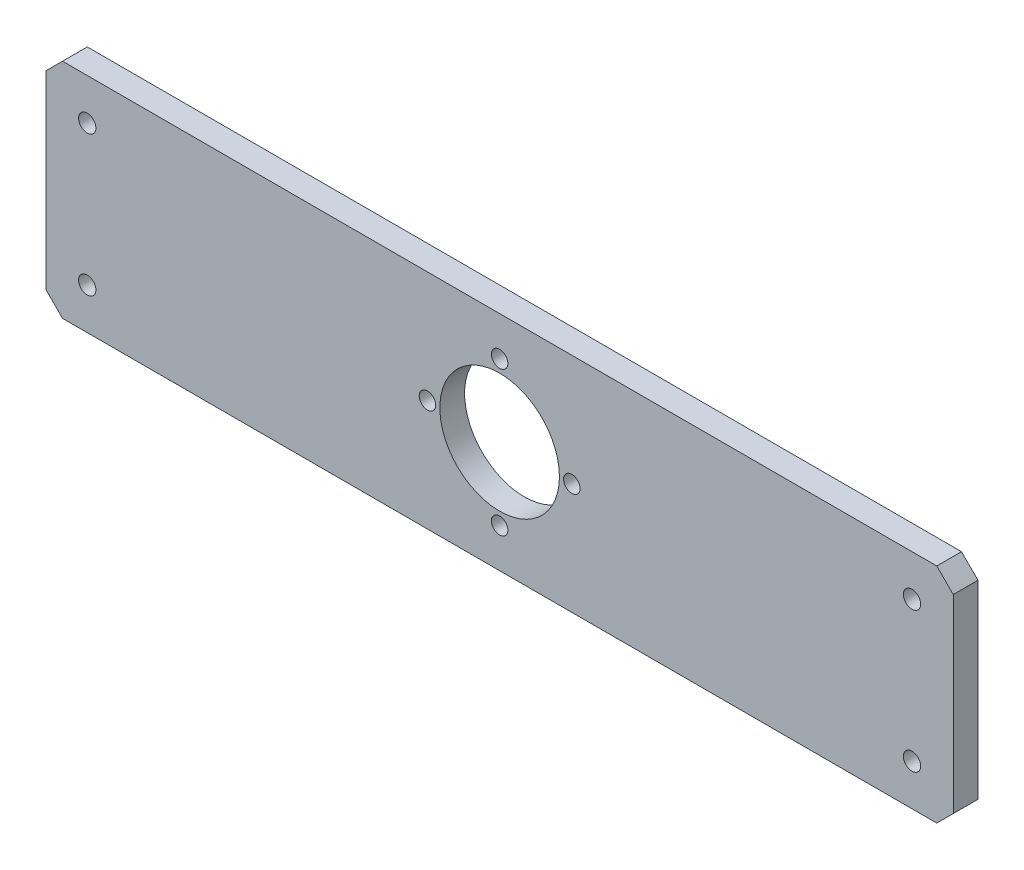
ISO-10303-21;
HEADER;
FILE_DESCRIPTION(('STEP AP214'),'2;1');
FILE_NAME('part.step','',(''),(''),'','','');
FILE_SCHEMA(('AUTOMOTIVE_DESIGN { 1 0 10303 214 1 1 1 1 }'));
ENDSEC;
DATA;
#1=APPLICATION_CONTEXT('core data for automotive mechanical design processes');
#2=APPLICATION_PROTOCOL_DEFINITION('international standard','automotive_design',2000,#1);
#3=PRODUCT_CONTEXT('',#1,'mechanical');
#4=PRODUCT('Part','Part','',(#3));
#5=PRODUCT_RELATED_PRODUCT_CATEGORY('part','',(#4));
#6=PRODUCT_DEFINITION_FORMATION('','',#4);
#7=PRODUCT_DEFINITION_CONTEXT('part definition',#1,'design');
#8=PRODUCT_DEFINITION('design','',#6,#7);
#9=PRODUCT_DEFINITION_SHAPE('','',#8);
#10=(LENGTH_UNIT() NAMED_UNIT(*) SI_UNIT(.MILLI.,.METRE.));
#11=(NAMED_UNIT(*) PLANE_ANGLE_UNIT() SI_UNIT($,.RADIAN.));
#12=(NAMED_UNIT(*) SI_UNIT($,.STERADIAN.) SOLID_ANGLE_UNIT());
#13=UNCERTAINTY_MEASURE_WITH_UNIT(LENGTH_MEASURE(1.E-05),#10,'distance_accuracy_value','');
#14=(GEOMETRIC_REPRESENTATION_CONTEXT(3) GLOBAL_UNCERTAINTY_ASSIGNED_CONTEXT((#13)) GLOBAL_UNIT_ASSIGNED_CONTEXT((#10,
#11,#12)) REPRESENTATION_CONTEXT('',''));
#15=CARTESIAN_POINT('',(0.,0.,0.));
#16=DIRECTION('',(0.,0.,1.));
#17=DIRECTION('',(1.,0.,0.));
#18=AXIS2_PLACEMENT_3D('',#15,#16,#17);
#19=CARTESIAN_POINT('',(0.,0.,3.));
#20=DIRECTION('',(0.,0.,1.));
#21=DIRECTION('',(1.,0.,0.));
#22=AXIS2_PLACEMENT_3D('',#19,#20,#21);
#23=PLANE('',#22);
#24=CARTESIAN_POINT('',(0.,-17.5,3.));
#25=DIRECTION('',(0.,0.,1.));
#26=DIRECTION('',(1.,0.,0.));
#27=AXIS2_PLACEMENT_3D('',#24,#25,#26);
#28=CIRCLE('',#27,2.);
#29=CARTESIAN_POINT('',(1.99999999999999,-17.5,3.));
#30=VERTEX_POINT('',#29);
#31=EDGE_CURVE('E219',#30,#30,#28,.T.);
#32=ORIENTED_EDGE('',*,*,#31,.F.);
#33=EDGE_LOOP('',(#32));
#34=FACE_BOUND('',#33,.T.);
#35=CARTESIAN_POINT('',(0.,0.,3.));
#36=DIRECTION('',(0.,0.,1.));
#37=DIRECTION('',(1.,0.,0.));
#38=AXIS2_PLACEMENT_3D('',#35,#36,#37);
#39=CIRCLE('',#38,14.5);
#40=CARTESIAN_POINT('',(14.5,0.,3.));
#41=VERTEX_POINT('',#40);
#42=EDGE_CURVE('E207',#41,#41,#39,.T.);
#43=ORIENTED_EDGE('',*,*,#42,.F.);
#44=EDGE_LOOP('',(#43));
#45=FACE_BOUND('',#44,.T.);
#46=CARTESIAN_POINT('',(100.,-17.,3.));
#47=DIRECTION('',(0.,0.,1.));
#48=DIRECTION('',(1.,0.,0.));
#49=AXIS2_PLACEMENT_3D('',#46,#47,#48);
#50=CIRCLE('',#49,2.1);
#51=CARTESIAN_POINT('',(102.1,-17.,3.));
#52=VERTEX_POINT('',#51);
#53=EDGE_CURVE('E195',#52,#52,#50,.T.);
#54=ORIENTED_EDGE('',*,*,#53,.F.);
#55=EDGE_LOOP('',(#54));
#56=FACE_BOUND('',#55,.T.);
#57=CARTESIAN_POINT('',(-100.,-17.,3.));
#58=DIRECTION('',(0.,0.,1.));
#59=DIRECTION('',(1.,0.,0.));
#60=AXIS2_PLACEMENT_3D('',#57,#58,#59);
#61=CIRCLE('',#60,2.1);
#62=CARTESIAN_POINT('',(-97.9,-17.,3.));
#63=VERTEX_POINT('',#62);
#64=EDGE_CURVE('E184',#63,#63,#61,.T.);
#65=ORIENTED_EDGE('',*,*,#64,.F.);
#66=EDGE_LOOP('',(#65));
#67=FACE_BOUND('',#66,.T.);
#68=DIRECTION('',(-1.,0.,0.));
#69=VECTOR('',#68,1.);
#70=CARTESIAN_POINT('',(110.,27.,3.));
#71=LINE('',#70,#69);
#72=CARTESIAN_POINT('',(106.,27.,3.));
#73=VERTEX_POINT('',#72);
#74=CARTESIAN_POINT('',(-106.,27.,3.));
#75=VERTEX_POINT('',#74);
#76=EDGE_CURVE('E139',#73,#75,#71,.T.);
#77=ORIENTED_EDGE('',*,*,#76,.T.);
#78=DIRECTION('',(0.70710678118655,0.707106781186545,0.));
#79=VECTOR('',#78,1.);
#80=CARTESIAN_POINT('',(-66.4999999999996,66.5,3.));
#81=LINE('',#80,#79);
#82=CARTESIAN_POINT('',(-110.,23.,3.));
#83=VERTEX_POINT('',#82);
#84=EDGE_CURVE('E158',#75,#83,#81,.F.);
#85=ORIENTED_EDGE('',*,*,#84,.T.);
#86=DIRECTION('',(0.,-1.,0.));
#87=VECTOR('',#86,1.);
#88=CARTESIAN_POINT('',(-110.,-27.,3.));
#89=LINE('',#88,#87);
#90=CARTESIAN_POINT('',(-110.,-23.,3.));
#91=VERTEX_POINT('',#90);
#92=EDGE_CURVE('E122',#83,#91,#89,.T.);
#93=ORIENTED_EDGE('',*,*,#92,.T.);
#94=DIRECTION('',(-0.707106781186548,0.707106781186548,0.));
#95=VECTOR('',#94,1.);
#96=CARTESIAN_POINT('',(-66.5,-66.5,3.));
#97=LINE('',#96,#95);
#98=CARTESIAN_POINT('',(-106.,-27.,3.));
#99=VERTEX_POINT('',#98);
#100=EDGE_CURVE('E156',#91,#99,#97,.F.);
#101=ORIENTED_EDGE('',*,*,#100,.T.);
#102=DIRECTION('',(1.,0.,0.));
#103=VECTOR('',#102,1.);
#104=CARTESIAN_POINT('',(110.,-27.,3.));
#105=LINE('',#104,#103);
#106=CARTESIAN_POINT('',(106.,-27.,3.));
#107=VERTEX_POINT('',#106);
#108=EDGE_CURVE('E169',#99,#107,#105,.T.);
#109=ORIENTED_EDGE('',*,*,#108,.T.);
#110=DIRECTION('',(-0.70710678118655,-0.707106781186545,0.));
#111=VECTOR('',#110,1.);
#112=CARTESIAN_POINT('',(66.4999999999996,-66.5000000000001,3.));
#113=LINE('',#112,#111);
#114=CARTESIAN_POINT('',(110.,-23.,3.));
#115=VERTEX_POINT('',#114);
#116=EDGE_CURVE('E57',#107,#115,#113,.F.);
#117=ORIENTED_EDGE('',*,*,#116,.T.);
#118=DIRECTION('',(0.,1.,0.));
#119=VECTOR('',#118,1.);
#120=CARTESIAN_POINT('',(110.,-27.,3.));
#121=LINE('',#120,#119);
#122=CARTESIAN_POINT('',(110.,23.,3.));
#123=VERTEX_POINT('',#122);
#124=EDGE_CURVE('E177',#115,#123,#121,.T.);
#125=ORIENTED_EDGE('',*,*,#124,.T.);
#126=DIRECTION('',(0.707106781186548,-0.707106781186548,0.));
#127=VECTOR('',#126,1.);
#128=CARTESIAN_POINT('',(66.5,66.5,3.));
#129=LINE('',#128,#127);
#130=EDGE_CURVE('E153',#123,#73,#129,.F.);
#131=ORIENTED_EDGE('',*,*,#130,.T.);
#132=EDGE_LOOP('',(#77,#85,#93,#101,#109,#117,#125,#131));
#133=FACE_BOUND('',#132,.T.);
#134=CARTESIAN_POINT('',(-100.,17.,3.));
#135=DIRECTION('',(0.,0.,1.));
#136=DIRECTION('',(1.,0.,0.));
#137=AXIS2_PLACEMENT_3D('',#134,#135,#136);
#138=CIRCLE('',#137,2.1);
#139=CARTESIAN_POINT('',(-97.9,17.,3.));
#140=VERTEX_POINT('',#139);
#141=EDGE_CURVE('E130',#140,#140,#138,.T.);
#142=ORIENTED_EDGE('',*,*,#141,.F.);
#143=EDGE_LOOP('',(#142));
#144=FACE_BOUND('',#143,.T.);
#145=CARTESIAN_POINT('',(100.,17.,3.));
#146=DIRECTION('',(0.,0.,1.));
#147=DIRECTION('',(1.,0.,0.));
#148=AXIS2_PLACEMENT_3D('',#145,#146,#147);
#149=CIRCLE('',#148,2.1);
#150=CARTESIAN_POINT('',(102.1,17.,3.));
#151=VERTEX_POINT('',#150);
#152=EDGE_CURVE('E189',#151,#151,#149,.T.);
#153=ORIENTED_EDGE('',*,*,#152,.F.);
#154=EDGE_LOOP('',(#153));
#155=FACE_BOUND('',#154,.T.);
#156=CARTESIAN_POINT('',(0.,17.5,3.));
#157=DIRECTION('',(0.,0.,1.));
#158=DIRECTION('',(1.,0.,0.));
#159=AXIS2_PLACEMENT_3D('',#156,#157,#158);
#160=CIRCLE('',#159,2.);
#161=CARTESIAN_POINT('',(1.99999999999999,17.5,3.));
#162=VERTEX_POINT('',#161);
#163=EDGE_CURVE('E201',#162,#162,#160,.T.);
#164=ORIENTED_EDGE('',*,*,#163,.F.);
#165=EDGE_LOOP('',(#164));
#166=FACE_BOUND('',#165,.T.);
#167=CARTESIAN_POINT('',(17.5,0.,3.));
#168=DIRECTION('',(0.,0.,1.));
#169=DIRECTION('',(1.,0.,0.));
#170=AXIS2_PLACEMENT_3D('',#167,#168,#169);
#171=CIRCLE('',#170,2.);
#172=CARTESIAN_POINT('',(19.5,0.,3.));
#173=VERTEX_POINT('',#172);
#174=EDGE_CURVE('E213',#173,#173,#171,.T.);
#175=ORIENTED_EDGE('',*,*,#174,.F.);
#176=EDGE_LOOP('',(#175));
#177=FACE_BOUND('',#176,.T.);
#178=CARTESIAN_POINT('',(-17.5,0.,3.));
#179=DIRECTION('',(0.,0.,1.));
#180=DIRECTION('',(1.,0.,0.));
#181=AXIS2_PLACEMENT_3D('',#178,#179,#180);
#182=CIRCLE('',#181,2.);
#183=CARTESIAN_POINT('',(-15.5,0.,3.));
#184=VERTEX_POINT('',#183);
#185=EDGE_CURVE('E225',#184,#184,#182,.T.);
#186=ORIENTED_EDGE('',*,*,#185,.F.);
#187=EDGE_LOOP('',(#186));
#188=FACE_BOUND('',#187,.T.);
#189=ADVANCED_FACE('F35',(#34,#45,#56,#67,#133,#144,#155,#166,#177,#188),#23,.T.);
#190=CARTESIAN_POINT('',(0.,0.,-3.));
#191=DIRECTION('',(0.,0.,1.));
#192=DIRECTION('',(1.,0.,0.));
#193=AXIS2_PLACEMENT_3D('',#190,#191,#192);
#194=PLANE('',#193);
#195=DIRECTION('',(0.,-1.,0.));
#196=VECTOR('',#195,1.);
#197=CARTESIAN_POINT('',(-110.,-27.,-3.));
#198=LINE('',#197,#196);
#199=CARTESIAN_POINT('',(-110.,23.,-3.));
#200=VERTEX_POINT('',#199);
#201=CARTESIAN_POINT('',(-110.,-23.,-3.));
#202=VERTEX_POINT('',#201);
#203=EDGE_CURVE('E119',#200,#202,#198,.T.);
#204=ORIENTED_EDGE('',*,*,#203,.F.);
#205=DIRECTION('',(-0.70710678118655,-0.707106781186545,0.));
#206=VECTOR('',#205,1.);
#207=CARTESIAN_POINT('',(-110.,23.,-3.));
#208=LINE('',#207,#206);
#209=CARTESIAN_POINT('',(-106.,27.,-3.));
#210=VERTEX_POINT('',#209);
#211=EDGE_CURVE('E102',#200,#210,#208,.F.);
#212=ORIENTED_EDGE('',*,*,#211,.T.);
#213=DIRECTION('',(-1.,0.,0.));
#214=VECTOR('',#213,1.);
#215=CARTESIAN_POINT('',(110.,27.,-3.));
#216=LINE('',#215,#214);
#217=CARTESIAN_POINT('',(106.,27.,-3.));
#218=VERTEX_POINT('',#217);
#219=EDGE_CURVE('E143',#218,#210,#216,.T.);
#220=ORIENTED_EDGE('',*,*,#219,.F.);
#221=DIRECTION('',(-0.707106781186548,0.707106781186548,0.));
#222=VECTOR('',#221,1.);
#223=CARTESIAN_POINT('',(106.,27.,-3.));
#224=LINE('',#223,#222);
#225=CARTESIAN_POINT('',(110.,23.,-3.));
#226=VERTEX_POINT('',#225);
#227=EDGE_CURVE('E123',#218,#226,#224,.F.);
#228=ORIENTED_EDGE('',*,*,#227,.T.);
#229=DIRECTION('',(0.,1.,0.));
#230=VECTOR('',#229,1.);
#231=CARTESIAN_POINT('',(110.,-27.,-3.));
#232=LINE('',#231,#230);
#233=CARTESIAN_POINT('',(110.,-23.,-3.));
#234=VERTEX_POINT('',#233);
#235=EDGE_CURVE('E133',#234,#226,#232,.T.);
#236=ORIENTED_EDGE('',*,*,#235,.F.);
#237=DIRECTION('',(0.70710678118655,0.707106781186545,0.));
#238=VECTOR('',#237,1.);
#239=CARTESIAN_POINT('',(110.,-23.,-3.));
#240=LINE('',#239,#238);
#241=CARTESIAN_POINT('',(106.,-27.,-3.));
#242=VERTEX_POINT('',#241);
#243=EDGE_CURVE('E147',#234,#242,#240,.F.);
#244=ORIENTED_EDGE('',*,*,#243,.T.);
#245=DIRECTION('',(1.,0.,0.));
#246=VECTOR('',#245,1.);
#247=CARTESIAN_POINT('',(110.,-27.,-3.));
#248=LINE('',#247,#246);
#249=CARTESIAN_POINT('',(-106.,-27.,-3.));
#250=VERTEX_POINT('',#249);
#251=EDGE_CURVE('E129',#250,#242,#248,.T.);
#252=ORIENTED_EDGE('',*,*,#251,.F.);
#253=DIRECTION('',(0.707106781186548,-0.707106781186548,0.));
#254=VECTOR('',#253,1.);
#255=CARTESIAN_POINT('',(-106.,-27.,-3.));
#256=LINE('',#255,#254);
#257=EDGE_CURVE('E113',#250,#202,#256,.F.);
#258=ORIENTED_EDGE('',*,*,#257,.T.);
#259=EDGE_LOOP('',(#204,#212,#220,#228,#236,#244,#252,#258));
#260=FACE_BOUND('',#259,.T.);
#261=CARTESIAN_POINT('',(-100.,17.,-3.));
#262=DIRECTION('',(0.,0.,1.));
#263=DIRECTION('',(1.,0.,0.));
#264=AXIS2_PLACEMENT_3D('',#261,#262,#263);
#265=CIRCLE('',#264,2.1);
#266=CARTESIAN_POINT('',(-97.9,17.,-3.));
#267=VERTEX_POINT('',#266);
#268=EDGE_CURVE('E136',#267,#267,#265,.T.);
#269=ORIENTED_EDGE('',*,*,#268,.T.);
#270=EDGE_LOOP('',(#269));
#271=FACE_BOUND('',#270,.T.);
#272=CARTESIAN_POINT('',(-100.,-17.,-3.));
#273=DIRECTION('',(0.,0.,1.));
#274=DIRECTION('',(1.,0.,0.));
#275=AXIS2_PLACEMENT_3D('',#272,#273,#274);
#276=CIRCLE('',#275,2.1);
#277=CARTESIAN_POINT('',(-97.9,-17.,-3.));
#278=VERTEX_POINT('',#277);
#279=EDGE_CURVE('E186',#278,#278,#276,.T.);
#280=ORIENTED_EDGE('',*,*,#279,.T.);
#281=EDGE_LOOP('',(#280));
#282=FACE_BOUND('',#281,.T.);
#283=CARTESIAN_POINT('',(100.,17.,-3.));
#284=DIRECTION('',(0.,0.,1.));
#285=DIRECTION('',(1.,0.,0.));
#286=AXIS2_PLACEMENT_3D('',#283,#284,#285);
#287=CIRCLE('',#286,2.1);
#288=CARTESIAN_POINT('',(102.1,17.,-3.));
#289=VERTEX_POINT('',#288);
#290=EDGE_CURVE('E192',#289,#289,#287,.T.);
#291=ORIENTED_EDGE('',*,*,#290,.T.);
#292=EDGE_LOOP('',(#291));
#293=FACE_BOUND('',#292,.T.);
#294=CARTESIAN_POINT('',(100.,-17.,-3.));
#295=DIRECTION('',(0.,0.,1.));
#296=DIRECTION('',(1.,0.,0.));
#297=AXIS2_PLACEMENT_3D('',#294,#295,#296);
#298=CIRCLE('',#297,2.1);
#299=CARTESIAN_POINT('',(102.1,-17.,-3.));
#300=VERTEX_POINT('',#299);
#301=EDGE_CURVE('E198',#300,#300,#298,.T.);
#302=ORIENTED_EDGE('',*,*,#301,.T.);
#303=EDGE_LOOP('',(#302));
#304=FACE_BOUND('',#303,.T.);
#305=CARTESIAN_POINT('',(0.,17.5,-3.));
#306=DIRECTION('',(0.,0.,1.));
#307=DIRECTION('',(1.,0.,0.));
#308=AXIS2_PLACEMENT_3D('',#305,#306,#307);
#309=CIRCLE('',#308,2.);
#310=CARTESIAN_POINT('',(1.99999999999999,17.5,-3.));
#311=VERTEX_POINT('',#310);
#312=EDGE_CURVE('E204',#311,#311,#309,.T.);
#313=ORIENTED_EDGE('',*,*,#312,.T.);
#314=EDGE_LOOP('',(#313));
#315=FACE_BOUND('',#314,.T.);
#316=CARTESIAN_POINT('',(0.,0.,-3.));
#317=DIRECTION('',(0.,0.,1.));
#318=DIRECTION('',(1.,0.,0.));
#319=AXIS2_PLACEMENT_3D('',#316,#317,#318);
#320=CIRCLE('',#319,14.5);
#321=CARTESIAN_POINT('',(14.5,0.,-3.));
#322=VERTEX_POINT('',#321);
#323=EDGE_CURVE('E210',#322,#322,#320,.T.);
#324=ORIENTED_EDGE('',*,*,#323,.T.);
#325=EDGE_LOOP('',(#324));
#326=FACE_BOUND('',#325,.T.);
#327=CARTESIAN_POINT('',(17.5,0.,-3.));
#328=DIRECTION('',(0.,0.,1.));
#329=DIRECTION('',(1.,0.,0.));
#330=AXIS2_PLACEMENT_3D('',#327,#328,#329);
#331=CIRCLE('',#330,2.);
#332=CARTESIAN_POINT('',(19.5,0.,-3.));
#333=VERTEX_POINT('',#332);
#334=EDGE_CURVE('E216',#333,#333,#331,.T.);
#335=ORIENTED_EDGE('',*,*,#334,.T.);
#336=EDGE_LOOP('',(#335));
#337=FACE_BOUND('',#336,.T.);
#338=CARTESIAN_POINT('',(0.,-17.5,-3.));
#339=DIRECTION('',(0.,0.,1.));
#340=DIRECTION('',(1.,0.,0.));
#341=AXIS2_PLACEMENT_3D('',#338,#339,#340);
#342=CIRCLE('',#341,2.);
#343=CARTESIAN_POINT('',(1.99999999999999,-17.5,-3.));
#344=VERTEX_POINT('',#343);
#345=EDGE_CURVE('E222',#344,#344,#342,.T.);
#346=ORIENTED_EDGE('',*,*,#345,.T.);
#347=EDGE_LOOP('',(#346));
#348=FACE_BOUND('',#347,.T.);
#349=CARTESIAN_POINT('',(-17.5,0.,-3.));
#350=DIRECTION('',(0.,0.,1.));
#351=DIRECTION('',(1.,0.,0.));
#352=AXIS2_PLACEMENT_3D('',#349,#350,#351);
#353=CIRCLE('',#352,2.);
#354=CARTESIAN_POINT('',(-15.5,0.,-3.));
#355=VERTEX_POINT('',#354);
#356=EDGE_CURVE('E228',#355,#355,#353,.T.);
#357=ORIENTED_EDGE('',*,*,#356,.T.);
#358=EDGE_LOOP('',(#357));
#359=FACE_BOUND('',#358,.T.);
#360=ADVANCED_FACE('F126',(#260,#271,#282,#293,#304,#315,#326,#337,#348,#359),#194,.F.);
#361=CARTESIAN_POINT('',(-110.,-27.,3.));
#362=DIRECTION('',(1.,0.,0.));
#363=DIRECTION('',(0.,1.,0.));
#364=AXIS2_PLACEMENT_3D('',#361,#362,#363);
#365=PLANE('',#364);
#366=ORIENTED_EDGE('',*,*,#92,.F.);
#367=DIRECTION('',(0.,0.,-1.));
#368=VECTOR('',#367,1.);
#369=CARTESIAN_POINT('',(-110.,23.,3.));
#370=LINE('',#369,#368);
#371=EDGE_CURVE('E106',#83,#200,#370,.T.);
#372=ORIENTED_EDGE('',*,*,#371,.T.);
#373=ORIENTED_EDGE('',*,*,#203,.T.);
#374=DIRECTION('',(0.,0.,1.));
#375=VECTOR('',#374,1.);
#376=CARTESIAN_POINT('',(-110.,-23.,3.));
#377=LINE('',#376,#375);
#378=EDGE_CURVE('E124',#202,#91,#377,.T.);
#379=ORIENTED_EDGE('',*,*,#378,.T.);
#380=EDGE_LOOP('',(#366,#372,#373,#379));
#381=FACE_BOUND('',#380,.T.);
#382=ADVANCED_FACE('F118',(#381),#365,.F.);
#383=CARTESIAN_POINT('',(110.,-27.,3.));
#384=DIRECTION('',(0.,1.,0.));
#385=DIRECTION('',(-1.,0.,0.));
#386=AXIS2_PLACEMENT_3D('',#383,#384,#385);
#387=PLANE('',#386);
#388=ORIENTED_EDGE('',*,*,#108,.F.);
#389=DIRECTION('',(0.,0.,-1.));
#390=VECTOR('',#389,1.);
#391=CARTESIAN_POINT('',(-106.,-27.,3.));
#392=LINE('',#391,#390);
#393=EDGE_CURVE('E162',#99,#250,#392,.T.);
#394=ORIENTED_EDGE('',*,*,#393,.T.);
#395=ORIENTED_EDGE('',*,*,#251,.T.);
#396=DIRECTION('',(0.,0.,1.));
#397=VECTOR('',#396,1.);
#398=CARTESIAN_POINT('',(106.,-27.,3.));
#399=LINE('',#398,#397);
#400=EDGE_CURVE('E160',#242,#107,#399,.T.);
#401=ORIENTED_EDGE('',*,*,#400,.T.);
#402=EDGE_LOOP('',(#388,#394,#395,#401));
#403=FACE_BOUND('',#402,.T.);
#404=ADVANCED_FACE('F167',(#403),#387,.F.);
#405=CARTESIAN_POINT('',(110.,-27.,3.));
#406=DIRECTION('',(-1.,0.,0.));
#407=DIRECTION('',(0.,0.,1.));
#408=AXIS2_PLACEMENT_3D('',#405,#406,#407);
#409=PLANE('',#408);
#410=ORIENTED_EDGE('',*,*,#124,.F.);
#411=DIRECTION('',(0.,0.,-1.));
#412=VECTOR('',#411,1.);
#413=CARTESIAN_POINT('',(110.,-23.,3.));
#414=LINE('',#413,#412);
#415=EDGE_CURVE('E11',#115,#234,#414,.T.);
#416=ORIENTED_EDGE('',*,*,#415,.T.);
#417=ORIENTED_EDGE('',*,*,#235,.T.);
#418=DIRECTION('',(0.,0.,1.));
#419=VECTOR('',#418,1.);
#420=CARTESIAN_POINT('',(110.,23.,3.));
#421=LINE('',#420,#419);
#422=EDGE_CURVE('E44',#226,#123,#421,.T.);
#423=ORIENTED_EDGE('',*,*,#422,.T.);
#424=EDGE_LOOP('',(#410,#416,#417,#423));
#425=FACE_BOUND('',#424,.T.);
#426=ADVANCED_FACE('F176',(#425),#409,.F.);
#427=CARTESIAN_POINT('',(110.,27.,3.));
#428=DIRECTION('',(0.,-1.,0.));
#429=DIRECTION('',(1.,0.,0.));
#430=AXIS2_PLACEMENT_3D('',#427,#428,#429);
#431=PLANE('',#430);
#432=ORIENTED_EDGE('',*,*,#219,.T.);
#433=DIRECTION('',(0.,0.,1.));
#434=VECTOR('',#433,1.);
#435=CARTESIAN_POINT('',(-106.,27.,3.));
#436=LINE('',#435,#434);
#437=EDGE_CURVE('E107',#210,#75,#436,.T.);
#438=ORIENTED_EDGE('',*,*,#437,.T.);
#439=ORIENTED_EDGE('',*,*,#76,.F.);
#440=DIRECTION('',(0.,0.,-1.));
#441=VECTOR('',#440,1.);
#442=CARTESIAN_POINT('',(106.,27.,3.));
#443=LINE('',#442,#441);
#444=EDGE_CURVE('E112',#73,#218,#443,.T.);
#445=ORIENTED_EDGE('',*,*,#444,.T.);
#446=EDGE_LOOP('',(#432,#438,#439,#445));
#447=FACE_BOUND('',#446,.T.);
#448=ADVANCED_FACE('F250',(#447),#431,.F.);
#449=CARTESIAN_POINT('',(-100.,17.,3.));
#450=DIRECTION('',(0.,0.,-1.));
#451=DIRECTION('',(-1.,0.,0.));
#452=AXIS2_PLACEMENT_3D('',#449,#450,#451);
#453=CYLINDRICAL_SURFACE('',#452,2.1);
#454=ORIENTED_EDGE('',*,*,#141,.T.);
#455=EDGE_LOOP('',(#454));
#456=FACE_BOUND('',#455,.T.);
#457=ORIENTED_EDGE('',*,*,#268,.F.);
#458=EDGE_LOOP('',(#457));
#459=FACE_BOUND('',#458,.T.);
#460=ADVANCED_FACE('F247',(#456,#459),#453,.F.);
#461=CARTESIAN_POINT('',(-100.,-17.,3.));
#462=DIRECTION('',(0.,0.,-1.));
#463=DIRECTION('',(-1.,0.,0.));
#464=AXIS2_PLACEMENT_3D('',#461,#462,#463);
#465=CYLINDRICAL_SURFACE('',#464,2.1);
#466=ORIENTED_EDGE('',*,*,#64,.T.);
#467=EDGE_LOOP('',(#466));
#468=FACE_BOUND('',#467,.T.);
#469=ORIENTED_EDGE('',*,*,#279,.F.);
#470=EDGE_LOOP('',(#469));
#471=FACE_BOUND('',#470,.T.);
#472=ADVANCED_FACE('F324',(#468,#471),#465,.F.);
#473=CARTESIAN_POINT('',(100.,17.,3.));
#474=DIRECTION('',(0.,0.,-1.));
#475=DIRECTION('',(-1.,0.,0.));
#476=AXIS2_PLACEMENT_3D('',#473,#474,#475);
#477=CYLINDRICAL_SURFACE('',#476,2.1);
#478=ORIENTED_EDGE('',*,*,#152,.T.);
#479=EDGE_LOOP('',(#478));
#480=FACE_BOUND('',#479,.T.);
#481=ORIENTED_EDGE('',*,*,#290,.F.);
#482=EDGE_LOOP('',(#481));
#483=FACE_BOUND('',#482,.T.);
#484=ADVANCED_FACE('F321',(#480,#483),#477,.F.);
#485=CARTESIAN_POINT('',(100.,-17.,3.));
#486=DIRECTION('',(0.,0.,-1.));
#487=DIRECTION('',(-1.,0.,0.));
#488=AXIS2_PLACEMENT_3D('',#485,#486,#487);
#489=CYLINDRICAL_SURFACE('',#488,2.1);
#490=ORIENTED_EDGE('',*,*,#53,.T.);
#491=EDGE_LOOP('',(#490));
#492=FACE_BOUND('',#491,.T.);
#493=ORIENTED_EDGE('',*,*,#301,.F.);
#494=EDGE_LOOP('',(#493));
#495=FACE_BOUND('',#494,.T.);
#496=ADVANCED_FACE('F317',(#492,#495),#489,.F.);
#497=CARTESIAN_POINT('',(0.,17.5,3.));
#498=DIRECTION('',(0.,0.,-1.));
#499=DIRECTION('',(-1.,0.,0.));
#500=AXIS2_PLACEMENT_3D('',#497,#498,#499);
#501=CYLINDRICAL_SURFACE('',#500,2.);
#502=ORIENTED_EDGE('',*,*,#163,.T.);
#503=EDGE_LOOP('',(#502));
#504=FACE_BOUND('',#503,.T.);
#505=ORIENTED_EDGE('',*,*,#312,.F.);
#506=EDGE_LOOP('',(#505));
#507=FACE_BOUND('',#506,.T.);
#508=ADVANCED_FACE('F313',(#504,#507),#501,.F.);
#509=CARTESIAN_POINT('',(0.,0.,3.));
#510=DIRECTION('',(0.,0.,-1.));
#511=DIRECTION('',(-1.,0.,0.));
#512=AXIS2_PLACEMENT_3D('',#509,#510,#511);
#513=CYLINDRICAL_SURFACE('',#512,14.5);
#514=ORIENTED_EDGE('',*,*,#42,.T.);
#515=EDGE_LOOP('',(#514));
#516=FACE_BOUND('',#515,.T.);
#517=ORIENTED_EDGE('',*,*,#323,.F.);
#518=EDGE_LOOP('',(#517));
#519=FACE_BOUND('',#518,.T.);
#520=ADVANCED_FACE('F295',(#516,#519),#513,.F.);
#521=CARTESIAN_POINT('',(17.5,0.,3.));
#522=DIRECTION('',(0.,0.,-1.));
#523=DIRECTION('',(-1.,0.,0.));
#524=AXIS2_PLACEMENT_3D('',#521,#522,#523);
#525=CYLINDRICAL_SURFACE('',#524,2.);
#526=ORIENTED_EDGE('',*,*,#174,.T.);
#527=EDGE_LOOP('',(#526));
#528=FACE_BOUND('',#527,.T.);
#529=ORIENTED_EDGE('',*,*,#334,.F.);
#530=EDGE_LOOP('',(#529));
#531=FACE_BOUND('',#530,.T.);
#532=ADVANCED_FACE('F291',(#528,#531),#525,.F.);
#533=CARTESIAN_POINT('',(0.,-17.5,3.));
#534=DIRECTION('',(0.,0.,-1.));
#535=DIRECTION('',(-1.,0.,0.));
#536=AXIS2_PLACEMENT_3D('',#533,#534,#535);
#537=CYLINDRICAL_SURFACE('',#536,2.);
#538=ORIENTED_EDGE('',*,*,#31,.T.);
#539=EDGE_LOOP('',(#538));
#540=FACE_BOUND('',#539,.T.);
#541=ORIENTED_EDGE('',*,*,#345,.F.);
#542=EDGE_LOOP('',(#541));
#543=FACE_BOUND('',#542,.T.);
#544=ADVANCED_FACE('F294',(#540,#543),#537,.F.);
#545=CARTESIAN_POINT('',(-17.5,0.,3.));
#546=DIRECTION('',(0.,0.,-1.));
#547=DIRECTION('',(-1.,0.,0.));
#548=AXIS2_PLACEMENT_3D('',#545,#546,#547);
#549=CYLINDRICAL_SURFACE('',#548,2.);
#550=ORIENTED_EDGE('',*,*,#185,.T.);
#551=EDGE_LOOP('',(#550));
#552=FACE_BOUND('',#551,.T.);
#553=ORIENTED_EDGE('',*,*,#356,.F.);
#554=EDGE_LOOP('',(#553));
#555=FACE_BOUND('',#554,.T.);
#556=ADVANCED_FACE('F234',(#552,#555),#549,.F.);
#557=CARTESIAN_POINT('',(-110.,23.,3.));
#558=DIRECTION('',(0.707106781186545,-0.70710678118655,0.));
#559=DIRECTION('',(0.,0.,-1.));
#560=AXIS2_PLACEMENT_3D('',#557,#558,#559);
#561=PLANE('',#560);
#562=ORIENTED_EDGE('',*,*,#84,.F.);
#563=ORIENTED_EDGE('',*,*,#437,.F.);
#564=ORIENTED_EDGE('',*,*,#211,.F.);
#565=ORIENTED_EDGE('',*,*,#371,.F.);
#566=EDGE_LOOP('',(#562,#563,#564,#565));
#567=FACE_BOUND('',#566,.T.);
#568=ADVANCED_FACE('F105',(#567),#561,.F.);
#569=CARTESIAN_POINT('',(-106.,-27.,3.));
#570=DIRECTION('',(0.707106781186547,0.707106781186547,0.));
#571=DIRECTION('',(0.,0.,-1.));
#572=AXIS2_PLACEMENT_3D('',#569,#570,#571);
#573=PLANE('',#572);
#574=ORIENTED_EDGE('',*,*,#100,.F.);
#575=ORIENTED_EDGE('',*,*,#378,.F.);
#576=ORIENTED_EDGE('',*,*,#257,.F.);
#577=ORIENTED_EDGE('',*,*,#393,.F.);
#578=EDGE_LOOP('',(#574,#575,#576,#577));
#579=FACE_BOUND('',#578,.T.);
#580=ADVANCED_FACE('F266',(#579),#573,.F.);
#581=CARTESIAN_POINT('',(110.,-23.,3.));
#582=DIRECTION('',(-0.707106781186545,0.70710678118655,0.));
#583=DIRECTION('',(0.,0.,-1.));
#584=AXIS2_PLACEMENT_3D('',#581,#582,#583);
#585=PLANE('',#584);
#586=ORIENTED_EDGE('',*,*,#116,.F.);
#587=ORIENTED_EDGE('',*,*,#400,.F.);
#588=ORIENTED_EDGE('',*,*,#243,.F.);
#589=ORIENTED_EDGE('',*,*,#415,.F.);
#590=EDGE_LOOP('',(#586,#587,#588,#589));
#591=FACE_BOUND('',#590,.T.);
#592=ADVANCED_FACE('F175',(#591),#585,.F.);
#593=CARTESIAN_POINT('',(106.,27.,3.));
#594=DIRECTION('',(-0.707106781186547,-0.707106781186547,0.));
#595=DIRECTION('',(0.,0.,-1.));
#596=AXIS2_PLACEMENT_3D('',#593,#594,#595);
#597=PLANE('',#596);
#598=ORIENTED_EDGE('',*,*,#130,.F.);
#599=ORIENTED_EDGE('',*,*,#422,.F.);
#600=ORIENTED_EDGE('',*,*,#227,.F.);
#601=ORIENTED_EDGE('',*,*,#444,.F.);
#602=EDGE_LOOP('',(#598,#599,#600,#601));
#603=FACE_BOUND('',#602,.T.);
#604=ADVANCED_FACE('F38',(#603),#597,.F.);
#605=CLOSED_SHELL('',(#189,#360,#382,#404,#426,#448,#460,#472,#484,#496,#508,#520,#532,#544,
#556,#568,#580,#592,#604));
#606=MANIFOLD_SOLID_BREP('B2',#605);
#607=ADVANCED_BREP_SHAPE_REPRESENTATION('',(#18,#606),#14);
#608=SHAPE_DEFINITION_REPRESENTATION(#9,#607);
ENDSEC;
END-ISO-10303-21;
